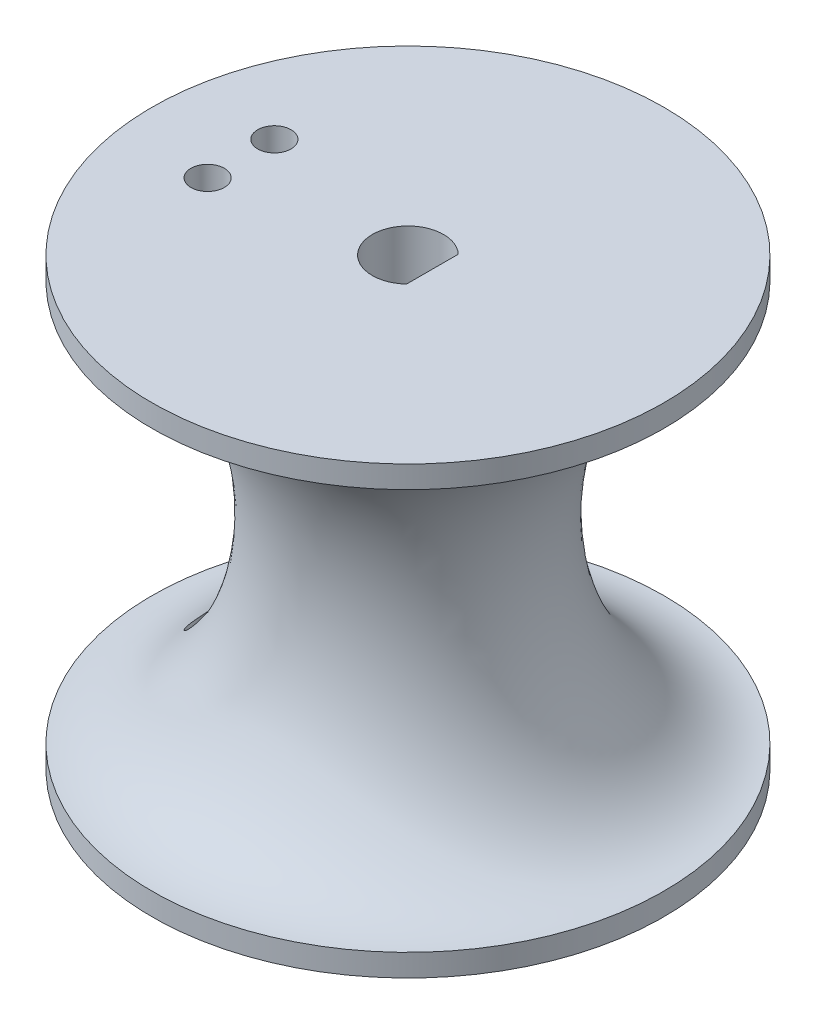
ISO-10303-21;
HEADER;
FILE_DESCRIPTION(('STEP AP214'),'2;1');
FILE_NAME('part.step','',(''),(''),'','','');
FILE_SCHEMA(('AUTOMOTIVE_DESIGN { 1 0 10303 214 1 1 1 1 }'));
ENDSEC;
DATA;
#1=APPLICATION_CONTEXT('core data for automotive mechanical design processes');
#2=APPLICATION_PROTOCOL_DEFINITION('international standard','automotive_design',2000,#1);
#3=PRODUCT_CONTEXT('',#1,'mechanical');
#4=PRODUCT('Part','Part','',(#3));
#5=PRODUCT_RELATED_PRODUCT_CATEGORY('part','',(#4));
#6=PRODUCT_DEFINITION_FORMATION('','',#4);
#7=PRODUCT_DEFINITION_CONTEXT('part definition',#1,'design');
#8=PRODUCT_DEFINITION('design','',#6,#7);
#9=PRODUCT_DEFINITION_SHAPE('','',#8);
#10=(LENGTH_UNIT() NAMED_UNIT(*) SI_UNIT(.MILLI.,.METRE.));
#11=(NAMED_UNIT(*) PLANE_ANGLE_UNIT() SI_UNIT($,.RADIAN.));
#12=(NAMED_UNIT(*) SI_UNIT($,.STERADIAN.) SOLID_ANGLE_UNIT());
#13=UNCERTAINTY_MEASURE_WITH_UNIT(LENGTH_MEASURE(1.E-05),#10,'distance_accuracy_value','');
#14=(GEOMETRIC_REPRESENTATION_CONTEXT(3) GLOBAL_UNCERTAINTY_ASSIGNED_CONTEXT((#13)) GLOBAL_UNIT_ASSIGNED_CONTEXT((#10,
#11,#12)) REPRESENTATION_CONTEXT('',''));
#15=CARTESIAN_POINT('',(0.,0.,0.));
#16=DIRECTION('',(0.,0.,1.));
#17=DIRECTION('',(1.,0.,0.));
#18=AXIS2_PLACEMENT_3D('',#15,#16,#17);
#19=CARTESIAN_POINT('',(0.,-1.5,0.));
#20=DIRECTION('',(0.,-1.,0.));
#21=DIRECTION('',(0.,0.,-1.));
#22=AXIS2_PLACEMENT_3D('',#19,#20,#21);
#23=CYLINDRICAL_SURFACE('',#22,23.);
#24=CARTESIAN_POINT('',(0.,40.,0.));
#25=DIRECTION('',(0.,-1.,0.));
#26=DIRECTION('',(0.,0.,-1.));
#27=AXIS2_PLACEMENT_3D('',#24,#25,#26);
#28=CIRCLE('',#27,23.);
#29=CARTESIAN_POINT('',(0.,40.,-23.));
#30=VERTEX_POINT('',#29);
#31=EDGE_CURVE('E11',#30,#30,#28,.T.);
#32=ORIENTED_EDGE('',*,*,#31,.T.);
#33=EDGE_LOOP('',(#32));
#34=FACE_BOUND('',#33,.T.);
#35=CARTESIAN_POINT('',(0.,38.,0.));
#36=DIRECTION('',(0.,-1.,0.));
#37=DIRECTION('',(0.,0.,-1.));
#38=AXIS2_PLACEMENT_3D('',#35,#36,#37);
#39=CIRCLE('',#38,23.);
#40=CARTESIAN_POINT('',(0.,38.,-23.));
#41=VERTEX_POINT('',#40);
#42=EDGE_CURVE('E39',#41,#41,#39,.T.);
#43=ORIENTED_EDGE('',*,*,#42,.F.);
#44=EDGE_LOOP('',(#43));
#45=FACE_BOUND('',#44,.T.);
#46=ADVANCED_FACE('F35',(#34,#45),#23,.T.);
#47=CARTESIAN_POINT('',(-23.,40.,0.));
#48=DIRECTION('',(0.,-1.,0.));
#49=DIRECTION('',(0.,0.,-1.));
#50=AXIS2_PLACEMENT_3D('',#47,#48,#49);
#51=PLANE('',#50);
#52=DIRECTION('',(0.,0.,1.));
#53=VECTOR('',#52,1.);
#54=CARTESIAN_POINT('',(2.2,40.,-2.32379000772445));
#55=LINE('',#54,#53);
#56=CARTESIAN_POINT('',(2.2,40.,-2.32379000772445));
#57=VERTEX_POINT('',#56);
#58=CARTESIAN_POINT('',(2.2,40.,2.32379000772445));
#59=VERTEX_POINT('',#58);
#60=EDGE_CURVE('E84',#57,#59,#55,.T.);
#61=ORIENTED_EDGE('',*,*,#60,.T.);
#62=CARTESIAN_POINT('',(0.,40.,0.));
#63=DIRECTION('',(0.,-1.,0.));
#64=DIRECTION('',(0.,0.,-1.));
#65=AXIS2_PLACEMENT_3D('',#62,#63,#64);
#66=CIRCLE('',#65,3.2);
#67=EDGE_CURVE('E52',#59,#57,#66,.T.);
#68=ORIENTED_EDGE('',*,*,#67,.T.);
#69=EDGE_LOOP('',(#61,#68));
#70=FACE_BOUND('',#69,.T.);
#71=CARTESIAN_POINT('',(-15.,40.,-3.));
#72=DIRECTION('',(0.,-1.,0.));
#73=DIRECTION('',(0.,0.,-1.));
#74=AXIS2_PLACEMENT_3D('',#71,#72,#73);
#75=CIRCLE('',#74,1.5);
#76=CARTESIAN_POINT('',(-15.,40.,-4.5));
#77=VERTEX_POINT('',#76);
#78=EDGE_CURVE('E78',#77,#77,#75,.T.);
#79=ORIENTED_EDGE('',*,*,#78,.T.);
#80=EDGE_LOOP('',(#79));
#81=FACE_BOUND('',#80,.T.);
#82=CARTESIAN_POINT('',(-15.,40.,3.));
#83=DIRECTION('',(0.,-1.,0.));
#84=DIRECTION('',(0.,0.,1.));
#85=AXIS2_PLACEMENT_3D('',#82,#83,#84);
#86=CIRCLE('',#85,1.5);
#87=CARTESIAN_POINT('',(-15.,40.,4.5));
#88=VERTEX_POINT('',#87);
#89=EDGE_CURVE('E90',#88,#88,#86,.T.);
#90=ORIENTED_EDGE('',*,*,#89,.T.);
#91=EDGE_LOOP('',(#90));
#92=FACE_BOUND('',#91,.T.);
#93=ORIENTED_EDGE('',*,*,#31,.F.);
#94=EDGE_LOOP('',(#93));
#95=FACE_BOUND('',#94,.T.);
#96=ADVANCED_FACE('F37',(#70,#81,#92,#95),#51,.F.);
#97=CARTESIAN_POINT('',(-23.,20.,0.));
#98=DIRECTION('',(0.,0.,1.));
#99=DIRECTION('',(0.,1.,0.));
#100=AXIS2_PLACEMENT_3D('',#97,#98,#99);
#101=ELLIPSE('',#100,18.,12.);
#102=CARTESIAN_POINT('',(0.,-1.5,0.));
#103=DIRECTION('',(0.,-1.,0.));
#104=AXIS1_PLACEMENT('',#102,#103);
#105=SURFACE_OF_REVOLUTION('',#101,#104);
#106=CARTESIAN_POINT('',(-15.,34.2406139442218,-4.5));
#107=CARTESIAN_POINT('',(-14.9350100897397,34.1684277342046,-4.5000012322229));
#108=CARTESIAN_POINT('',(-14.871434571679,34.094971794309,-4.49578508029407));
#109=CARTESIAN_POINT('',(-14.7474744455794,33.9461437740975,-4.47991142042085));
#110=CARTESIAN_POINT('',(-14.6870921871256,33.8707703416695,-4.46824851346216));
#111=CARTESIAN_POINT('',(-14.569517977669,33.718340252366,-4.43818772876105));
#112=CARTESIAN_POINT('',(-14.5123418573675,33.6412774800004,-4.41975933363757));
#113=CARTESIAN_POINT('',(-14.4016312249574,33.4862966933333,-4.37676449680087));
#114=CARTESIAN_POINT('',(-14.3480958639161,33.4083788833601,-4.35219949227571));
#115=CARTESIAN_POINT('',(-14.2423351095714,33.2484606175508,-4.29603061594189));
#116=CARTESIAN_POINT('',(-14.1902874387952,33.1664393272209,-4.26415175883944));
#117=CARTESIAN_POINT('',(-14.0903884054189,33.0024416542551,-4.19428767489236));
#118=CARTESIAN_POINT('',(-14.0425370383143,32.920465271571,-4.15630245460265));
#119=CARTESIAN_POINT('',(-13.9513809431258,32.7574699270498,-4.07431068462483));
#120=CARTESIAN_POINT('',(-13.9080598617781,32.6764485296206,-4.03032721336925));
#121=CARTESIAN_POINT('',(-13.8260945887054,32.5158883585745,-3.93587316800596));
#122=CARTESIAN_POINT('',(-13.7874469086239,32.4363485170718,-3.88540749115208));
#123=CARTESIAN_POINT('',(-13.7232179811447,32.2969344801562,-3.78893187165097));
#124=CARTESIAN_POINT('',(-13.6966234283623,32.2365472006551,-3.74434186156628));
#125=CARTESIAN_POINT('',(-13.6470734673021,32.1182125914091,-3.64995144616536));
#126=CARTESIAN_POINT('',(-13.6241224898726,32.060268294419,-3.60014481733635));
#127=CARTESIAN_POINT('',(-13.5825218563416,31.9479162680066,-3.49400534340336));
#128=CARTESIAN_POINT('',(-13.5639101585352,31.8935425343061,-3.43762094037126));
#129=CARTESIAN_POINT('',(-13.5326719466759,31.7915953502388,-3.31747148603314));
#130=CARTESIAN_POINT('',(-13.5200280235999,31.7440024063018,-3.25372858635741));
#131=CARTESIAN_POINT('',(-13.5067862279881,31.6787179914835,-3.14760993035048));
#132=CARTESIAN_POINT('',(-13.5033389938334,31.6570464189172,-3.10806396594339));
#133=CARTESIAN_POINT('',(-13.4996774171456,31.618720414169,-3.02643276357983));
#134=CARTESIAN_POINT('',(-13.4994606864801,31.602062284753,-2.98434942447428));
#135=CARTESIAN_POINT('',(-13.5028589743482,31.5751008449584,-2.89769840010615));
#136=CARTESIAN_POINT('',(-13.5065209741273,31.5648778981368,-2.85310659302476));
#137=CARTESIAN_POINT('',(-13.5180952713408,31.5524747446701,-2.76336825867317));
#138=CARTESIAN_POINT('',(-13.5260014399742,31.5502829762126,-2.71822262279049));
#139=CARTESIAN_POINT('',(-13.5445445293213,31.5539783830266,-2.63499157802872));
#140=CARTESIAN_POINT('',(-13.5546964370878,31.5588579911863,-2.59674780477223));
#141=CARTESIAN_POINT('',(-13.5775797917092,31.5743738903976,-2.52225254860966));
#142=CARTESIAN_POINT('',(-13.5903135848215,31.5850154323364,-2.48600291622174));
#143=CARTESIAN_POINT('',(-13.6227264328768,31.6157844607113,-2.40357535972314));
#144=CARTESIAN_POINT('',(-13.6432580121201,31.6379456400951,-2.358502727509));
#145=CARTESIAN_POINT('',(-13.6868595127811,31.6886640627381,-2.27338628340653));
#146=CARTESIAN_POINT('',(-13.7099386202141,31.7172448645314,-2.23336186432555));
#147=CARTESIAN_POINT('',(-13.7542523760365,31.774264151253,-2.16360455874971));
#148=CARTESIAN_POINT('',(-13.7752585978401,31.8021045407078,-2.13322395816701));
#149=CARTESIAN_POINT('',(-13.8181564157474,31.8600944034168,-2.07558964578018));
#150=CARTESIAN_POINT('',(-13.8400465683254,31.8902401784785,-2.04833109419751));
#151=CARTESIAN_POINT('',(-13.884614063887,31.9523695353553,-1.9964628369381));
#152=CARTESIAN_POINT('',(-13.9072936260237,31.9843584973776,-1.97186155807506));
#153=CARTESIAN_POINT('',(-13.9532591882495,32.0496724405392,-1.92510117684684));
#154=CARTESIAN_POINT('',(-13.9765454624513,32.0829980293674,-1.90294320287881));
#155=CARTESIAN_POINT('',(-14.0456874567492,32.1823388961603,-1.8411042213606));
#156=CARTESIAN_POINT('',(-14.0922591039129,32.2497439189827,-1.80444335404944));
#157=CARTESIAN_POINT('',(-14.1870084407787,32.3868232445888,-1.73810271773203));
#158=CARTESIAN_POINT('',(-14.2351872157183,32.4564990800127,-1.70842777967573));
#159=CARTESIAN_POINT('',(-14.3330331267048,32.5972857166462,-1.65528562501119));
#160=CARTESIAN_POINT('',(-14.3827020036937,32.6683981619024,-1.63182601156539));
#161=CARTESIAN_POINT('',(-14.4833714607026,32.8113620501289,-1.59072720874401));
#162=CARTESIAN_POINT('',(-14.534372252209,32.8832136093471,-1.57308894984422));
#163=CARTESIAN_POINT('',(-14.6422955563917,33.0337196190835,-1.54209773804245));
#164=CARTESIAN_POINT('',(-14.6993356167997,33.1124000152954,-1.52927855183937));
#165=CARTESIAN_POINT('',(-14.8147593960751,33.2696017383435,-1.5103335777489));
#166=CARTESIAN_POINT('',(-14.8731433563076,33.3481230338059,-1.50420900194596));
#167=CARTESIAN_POINT('',(-14.9909873499765,33.5044557789747,-1.49886932064048));
#168=CARTESIAN_POINT('',(-15.0504459823968,33.582267978378,-1.49964578729878));
#169=CARTESIAN_POINT('',(-15.1701966678908,33.7367912895732,-1.50847907790304));
#170=CARTESIAN_POINT('',(-15.2304884929244,33.8135026913733,-1.5165339471835));
#171=CARTESIAN_POINT('',(-15.38555339654,34.0080459805364,-1.54719190785291));
#172=CARTESIAN_POINT('',(-15.4806806045322,34.1247837812152,-1.57542396257802));
#173=CARTESIAN_POINT('',(-15.669468392177,34.3519947921834,-1.65380767277555));
#174=CARTESIAN_POINT('',(-15.7631306664739,34.4624756994128,-1.70393170565313));
#175=CARTESIAN_POINT('',(-15.9200901248196,34.6453949886028,-1.81259346720601));
#176=CARTESIAN_POINT('',(-15.9847931583523,34.7200884672439,-1.86526769520322));
#177=CARTESIAN_POINT('',(-16.1081284695424,34.862351833323,-1.98538842467332));
#178=CARTESIAN_POINT('',(-16.166769235992,34.9299316842234,-2.05281384638244));
#179=CARTESIAN_POINT('',(-16.2616967745426,35.0409557356986,-2.18565146159392));
#180=CARTESIAN_POINT('',(-16.3000209037217,35.0863732093309,-2.24794761264547));
#181=CARTESIAN_POINT('',(-16.3684962369868,35.1700329931097,-2.38128022925625));
#182=CARTESIAN_POINT('',(-16.39865675717,35.2082834665708,-2.45230659631833));
#183=CARTESIAN_POINT('',(-16.4443441708204,35.2705416128435,-2.58982780566146));
#184=CARTESIAN_POINT('',(-16.4614467582947,35.2958514593066,-2.65520565182677));
#185=CARTESIAN_POINT('',(-16.4868002465257,35.3393507698362,-2.78996139578918));
#186=CARTESIAN_POINT('',(-16.4950545677665,35.3575429836456,-2.85933773694671));
#187=CARTESIAN_POINT('',(-16.5016714940446,35.3860611032112,-3.00054444205227));
#188=CARTESIAN_POINT('',(-16.4999851376093,35.3963477901916,-3.07238521720542));
#189=CARTESIAN_POINT('',(-16.4861432853246,35.4083724994143,-3.21577627530713));
#190=CARTESIAN_POINT('',(-16.4739912870685,35.4101133763445,-3.28732664728233));
#191=CARTESIAN_POINT('',(-16.4410822331219,35.4051915987426,-3.42146445619727));
#192=CARTESIAN_POINT('',(-16.4211696146508,35.3992497591532,-3.48428885298939));
#193=CARTESIAN_POINT('',(-16.3737414804144,35.3804483070847,-3.60588176241475));
#194=CARTESIAN_POINT('',(-16.3462262740761,35.3675889761289,-3.66465043999507));
#195=CARTESIAN_POINT('',(-16.2844468201841,35.3352994560021,-3.77741739011953));
#196=CARTESIAN_POINT('',(-16.2501122027416,35.3157990961598,-3.83135660969012));
#197=CARTESIAN_POINT('',(-16.1762957471743,35.2709716591804,-3.93288386788125));
#198=CARTESIAN_POINT('',(-16.136812659735,35.2456431666594,-3.98047035927468));
#199=CARTESIAN_POINT('',(-16.0492554397883,35.186668932733,-4.07407497943163));
#200=CARTESIAN_POINT('',(-16.0007165737212,35.1523970374733,-4.11925948533753));
#201=CARTESIAN_POINT('',(-15.9006318776524,35.0785431104962,-4.20127366195799));
#202=CARTESIAN_POINT('',(-15.8490817948863,35.0389534607374,-4.23809113879433));
#203=CARTESIAN_POINT('',(-15.7562109208945,34.9648266733422,-4.29631737949796));
#204=CARTESIAN_POINT('',(-15.7151904128255,34.9311492175385,-4.31932990875198));
#205=CARTESIAN_POINT('',(-15.6327851703762,34.8615991510164,-4.36077490792615));
#206=CARTESIAN_POINT('',(-15.5914007365902,34.8257282285359,-4.37921084634654));
#207=CARTESIAN_POINT('',(-15.4671678632144,34.7151630396283,-4.42817611497831));
#208=CARTESIAN_POINT('',(-15.3843118285803,34.637573723557,-4.45231973943628));
#209=CARTESIAN_POINT('',(-15.251028716207,34.5064159248377,-4.4797897014654));
#210=CARTESIAN_POINT('',(-15.1998189728623,34.4544345836847,-4.48749955759076));
#211=CARTESIAN_POINT('',(-15.0988060133021,34.348745786009,-4.49760062993817));
#212=CARTESIAN_POINT('',(-15.0490009775684,34.2950407751503,-4.49999907093076));
#213=CARTESIAN_POINT('',(-15.,34.2406139442218,-4.5));
#214=B_SPLINE_CURVE_WITH_KNOTS('',3,(#106,#107,#108,#109,#110,#111,#112,#113,#114,#115,#116,
#117,#118,#119,#120,#121,#122,#123,#124,#125,#126,#127,#128,#129,#130,#131,#132,#133,#134,#135,
#136,#137,#138,#139,#140,#141,#142,#143,#144,#145,#146,#147,#148,#149,#150,#151,#152,#153,#154,
#155,#156,#157,#158,#159,#160,#161,#162,#163,#164,#165,#166,#167,#168,#169,#170,#171,#172,#173,
#174,#175,#176,#177,#178,#179,#180,#181,#182,#183,#184,#185,#186,#187,#188,#189,#190,#191,#192,
#193,#194,#195,#196,#197,#198,#199,#200,#201,#202,#203,#204,#205,#206,#207,#208,#209,#210,#211,
#212,#213),.UNSPECIFIED.,.T.,.F.,(4,2,2,2,2,2,2,2,2,2,2,2,2,2,2,2,2,2,2,2,2,2,2,2,2,2,2,2,2,2,2,
2,2,2,2,2,2,2,2,2,2,2,2,2,2,2,2,2,2,2,2,2,2,4),(0.,0.291306442662013,0.582824327259284,
0.875673663246119,1.16845447839207,1.47489851801443,1.78134222868475,2.08663851126706,
2.39170548685757,2.63039053960422,2.86936366306828,3.11035475238974,3.35063841662319,
3.48595790075455,3.62117734571415,3.75805357403736,3.89473267557063,4.01374639695004,
4.13286875928803,4.29473872763595,4.45721271886433,4.59577524765942,4.73411998425114,
4.87289130309558,5.01172644494157,5.28056450348733,5.54958792792815,5.81893894297376,
6.08833298981838,6.38216066224557,6.67604152447355,6.9695635365715,7.26300674471766,
7.72120199357665,8.17882076909496,8.51368721623705,8.84807822207352,9.10541784891248,
9.36246255636416,9.57804610544692,9.79354628607125,10.0101087678722,10.2265989030637,
10.4241773045357,10.6217476657055,10.8214739350523,11.0212487599644,11.244376991748,
11.4678283484017,11.6411387234053,11.8143173464054,12.1609758447391,12.3809139126456,
12.6005526289515),.UNSPECIFIED.);
#215=CARTESIAN_POINT('',(-15.,34.2406139442218,-4.5));
#216=VERTEX_POINT('',#215);
#217=EDGE_CURVE('E133',#216,#216,#214,.T.);
#218=ORIENTED_EDGE('',*,*,#217,.F.);
#219=EDGE_LOOP('',(#218));
#220=FACE_BOUND('',#219,.T.);
#221=CARTESIAN_POINT('',(-15.,5.75938605577824,-4.5));
#222=CARTESIAN_POINT('',(-15.0847339145067,5.66527186816123,-4.50000234360664));
#223=CARTESIAN_POINT('',(-15.1719209077483,5.57326443984956,-4.49284659967696));
#224=CARTESIAN_POINT('',(-15.3496287786371,5.39542564835471,-4.46146989123623));
#225=CARTESIAN_POINT('',(-15.4401483801787,5.30959195758755,-4.43725539567112));
#226=CARTESIAN_POINT('',(-15.6005535202079,5.16570084478835,-4.37654217901424));
#227=CARTESIAN_POINT('',(-15.6703436711977,5.10582509369986,-4.3442081087544));
#228=CARTESIAN_POINT('',(-15.7735357015416,5.02122565540318,-4.28576917946393));
#229=CARTESIAN_POINT('',(-15.8076652129111,4.99390891512623,-4.26464804794461));
#230=CARTESIAN_POINT('',(-15.8751506895989,4.9411902796168,-4.21892410608714));
#231=CARTESIAN_POINT('',(-15.9085056455036,4.91579079557056,-4.19431701997927));
#232=CARTESIAN_POINT('',(-15.9948622151934,4.85173549260089,-4.1247130274527));
#233=CARTESIAN_POINT('',(-16.0468693005553,4.81492084182204,-4.07670063675587));
#234=CARTESIAN_POINT('',(-16.1454551130474,4.74855337335497,-3.9711552342321));
#235=CARTESIAN_POINT('',(-16.1920418433816,4.71898977602103,-3.91363657045719));
#236=CARTESIAN_POINT('',(-16.2779096792503,4.66811675272171,-3.7891081168047));
#237=CARTESIAN_POINT('',(-16.3171231987395,4.6468819168616,-3.72201958407359));
#238=CARTESIAN_POINT('',(-16.3682089428492,4.62240665179734,-3.61607831842126));
#239=CARTESIAN_POINT('',(-16.3839507889058,4.61547708617357,-3.57987211314014));
#240=CARTESIAN_POINT('',(-16.4126396920364,4.60416075387769,-3.50598316357695));
#241=CARTESIAN_POINT('',(-16.425586879263,4.59977386877205,-3.46830048815352));
#242=CARTESIAN_POINT('',(-16.4567124192002,4.59141243800504,-3.36426394680241));
#243=CARTESIAN_POINT('',(-16.4719565054317,4.59000335930287,-3.29678032158883));
#244=CARTESIAN_POINT('',(-16.4929574611559,4.59503347997107,-3.16069663600636));
#245=CARTESIAN_POINT('',(-16.4987173897261,4.60147014756083,-3.09209694283328));
#246=CARTESIAN_POINT('',(-16.5008428269755,4.62134507369807,-2.95938463504236));
#247=CARTESIAN_POINT('',(-16.4976730605651,4.63440899531207,-2.89522177599968));
#248=CARTESIAN_POINT('',(-16.4835229034861,4.66679002246204,-2.7694118202554));
#249=CARTESIAN_POINT('',(-16.4725416537872,4.68610781561025,-2.70776500103168));
#250=CARTESIAN_POINT('',(-16.4426858804011,4.73186202509947,-2.58409196166531));
#251=CARTESIAN_POINT('',(-16.4233177298452,4.75869854250697,-2.52233468828286));
#252=CARTESIAN_POINT('',(-16.3780190877838,4.81786767186665,-2.40411417460727));
#253=CARTESIAN_POINT('',(-16.3520847435022,4.85020350692569,-2.34765406922741));
#254=CARTESIAN_POINT('',(-16.2818557811383,4.93543900633272,-2.21598662759106));
#255=CARTESIAN_POINT('',(-16.2345950844677,4.99096925525046,-2.14405365275859));
#256=CARTESIAN_POINT('',(-16.132522599091,5.10960542019726,-2.01291786479959));
#257=CARTESIAN_POINT('',(-16.0776952182708,5.17272694355732,-1.95374200164178));
#258=CARTESIAN_POINT('',(-15.9410163132408,5.33045412398603,-1.8268583769149));
#259=CARTESIAN_POINT('',(-15.8569749420454,5.42772616668202,-1.76484847055823));
#260=CARTESIAN_POINT('',(-15.6850976594923,5.62964570906173,-1.66182446710084));
#261=CARTESIAN_POINT('',(-15.5972562447539,5.734304054396,-1.62084200720489));
#262=CARTESIAN_POINT('',(-15.4458122873436,5.91824972453843,-1.5662036971677));
#263=CARTESIAN_POINT('',(-15.3823447908156,5.99638890581022,-1.54810336466427));
#264=CARTESIAN_POINT('',(-15.2557717977773,6.1545152154484,-1.52054759064312));
#265=CARTESIAN_POINT('',(-15.1926664816635,6.23450317922354,-1.51109613880992));
#266=CARTESIAN_POINT('',(-15.0672282582972,6.39586572566627,-1.50018260588977));
#267=CARTESIAN_POINT('',(-15.0048972411841,6.47724285712897,-1.49873726507087));
#268=CARTESIAN_POINT('',(-14.8814831840453,6.64068662836589,-1.50341507497414));
#269=CARTESIAN_POINT('',(-14.8203998953942,6.72275312608387,-1.5095367026296));
#270=CARTESIAN_POINT('',(-14.6977746451778,6.88968966475657,-1.52940806712871));
#271=CARTESIAN_POINT('',(-14.636279602311,6.97456605634147,-1.54339362593982));
#272=CARTESIAN_POINT('',(-14.5149814515832,7.14395150563199,-1.57916963212555));
#273=CARTESIAN_POINT('',(-14.4551791226742,7.22846037954689,-1.60096361173734));
#274=CARTESIAN_POINT('',(-14.3375016240168,7.39620366088124,-1.65269696645786));
#275=CARTESIAN_POINT('',(-14.2796246814199,7.47943920032904,-1.68262860174267));
#276=CARTESIAN_POINT('',(-14.165964487922,7.64354782996233,-1.75147838608104));
#277=CARTESIAN_POINT('',(-14.1101790516289,7.72442336531867,-1.7903868328838));
#278=CARTESIAN_POINT('',(-14.0283934420035,7.84248088664338,-1.85667057191302));
#279=CARTESIAN_POINT('',(-14.0014644085506,7.88126586224162,-1.88006700539194));
#280=CARTESIAN_POINT('',(-13.9483155071715,7.95738562109604,-1.929819389048));
#281=CARTESIAN_POINT('',(-13.9220953372097,7.9947210250466,-1.95617405329873));
#282=CARTESIAN_POINT('',(-13.8706077688782,8.06727682763083,-2.01211719634154));
#283=CARTESIAN_POINT('',(-13.8453368280222,8.10250545897708,-2.04169161231956));
#284=CARTESIAN_POINT('',(-13.7958909468703,8.17022511371182,-2.10461111182265));
#285=CARTESIAN_POINT('',(-13.7717148723915,8.20271900146815,-2.13795216220696));
#286=CARTESIAN_POINT('',(-13.7265703684328,8.26161040126388,-2.20632039282608));
#287=CARTESIAN_POINT('',(-13.7054970638258,8.28828145590832,-2.24103842270582));
#288=CARTESIAN_POINT('',(-13.6651078636742,8.33707156868051,-2.31456497258286));
#289=CARTESIAN_POINT('',(-13.6457925750962,8.35918905796138,-2.35337489542593));
#290=CARTESIAN_POINT('',(-13.6094513184061,8.39741154573477,-2.43571050332586));
#291=CARTESIAN_POINT('',(-13.5924609963544,8.41342848017468,-2.47929435809983));
#292=CARTESIAN_POINT('',(-13.5622023090794,8.43698367409999,-2.56988537275983));
#293=CARTESIAN_POINT('',(-13.5489241236103,8.44454446611688,-2.61688307794721));
#294=CARTESIAN_POINT('',(-13.5284575558661,8.44965349541764,-2.70610617887458));
#295=CARTESIAN_POINT('',(-13.5206931832042,8.4484025557659,-2.74813214467176));
#296=CARTESIAN_POINT('',(-13.5088463221748,8.43884520043941,-2.83191017257736));
#297=CARTESIAN_POINT('',(-13.5047673263584,8.43053210655726,-2.87366193772031));
#298=CARTESIAN_POINT('',(-13.4997117942735,8.40596310047698,-2.96232395460568));
#299=CARTESIAN_POINT('',(-13.4993505397864,8.3886319565895,-3.00896343449463));
#300=CARTESIAN_POINT('',(-13.5026042818345,8.34769637525646,-3.09931944016209));
#301=CARTESIAN_POINT('',(-13.5062320807581,8.32407192506843,-3.14302607440973));
#302=CARTESIAN_POINT('',(-13.5157083487553,8.277248233166,-3.21922509391792));
#303=CARTESIAN_POINT('',(-13.5210055448602,8.25481720325898,-3.25227279404319));
#304=CARTESIAN_POINT('',(-13.5333671432562,8.20773836957716,-3.31630415395772));
#305=CARTESIAN_POINT('',(-13.540428984498,8.18309381123825,-3.34729072327824));
#306=CARTESIAN_POINT('',(-13.5639061037997,8.10646153461083,-3.4376376762946));
#307=CARTESIAN_POINT('',(-13.5825887159074,8.05188663221323,-3.49421489640299));
#308=CARTESIAN_POINT('',(-13.6238005301869,7.94061728659225,-3.59928557037115));
#309=CARTESIAN_POINT('',(-13.6461776910841,7.88405760920249,-3.64798818729659));
#310=CARTESIAN_POINT('',(-13.6944782083624,7.7684531222551,-3.74049622104284));
#311=CARTESIAN_POINT('',(-13.7204041013519,7.70940655617856,-3.78429809377318));
#312=CARTESIAN_POINT('',(-13.7754044952107,7.58958484959329,-3.86767812426184));
#313=CARTESIAN_POINT('',(-13.8044869616806,7.52880563542755,-3.9072450714778));
#314=CARTESIAN_POINT('',(-13.8654716619821,7.40622547511702,-3.98243934284986));
#315=CARTESIAN_POINT('',(-13.8973746042934,7.34442427544556,-4.01806567206812));
#316=CARTESIAN_POINT('',(-13.9801336111183,7.18972783932721,-4.10221122484555));
#317=CARTESIAN_POINT('',(-14.032605717947,7.09646153036661,-4.14847426464989));
#318=CARTESIAN_POINT('',(-14.1430959140952,6.90956942165563,-4.23310828912512));
#319=CARTESIAN_POINT('',(-14.2011173002926,6.81594344032084,-4.27147453904299));
#320=CARTESIAN_POINT('',(-14.3223003986215,6.62946988687639,-4.33998190585107));
#321=CARTESIAN_POINT('',(-14.3854448756418,6.53662077646272,-4.37014922801641));
#322=CARTESIAN_POINT('',(-14.516828250467,6.35220567637362,-4.42180272614641));
#323=CARTESIAN_POINT('',(-14.5850628887921,6.26063868836271,-4.44329606611152));
#324=CARTESIAN_POINT('',(-14.710323759202,6.10015068342231,-4.47283063846429));
#325=CARTESIAN_POINT('',(-14.7663656083531,6.030819485966,-4.48282031473015));
#326=CARTESIAN_POINT('',(-14.8811940318363,5.89376813200396,-4.49640538893355));
#327=CARTESIAN_POINT('',(-14.9399816476626,5.82604860176393,-4.49999833998689));
#328=CARTESIAN_POINT('',(-15.,5.75938605577824,-4.5));
#329=B_SPLINE_CURVE_WITH_KNOTS('',3,(#221,#222,#223,#224,#225,#226,#227,#228,#229,#230,#231,
#232,#233,#234,#235,#236,#237,#238,#239,#240,#241,#242,#243,#244,#245,#246,#247,#248,#249,#250,
#251,#252,#253,#254,#255,#256,#257,#258,#259,#260,#261,#262,#263,#264,#265,#266,#267,#268,#269,
#270,#271,#272,#273,#274,#275,#276,#277,#278,#279,#280,#281,#282,#283,#284,#285,#286,#287,#288,
#289,#290,#291,#292,#293,#294,#295,#296,#297,#298,#299,#300,#301,#302,#303,#304,#305,#306,#307,
#308,#309,#310,#311,#312,#313,#314,#315,#316,#317,#318,#319,#320,#321,#322,#323,#324,#325,#326,
#327,#328),.UNSPECIFIED.,.T.,.F.,(4,2,2,2,2,2,2,2,2,2,2,2,2,2,2,2,2,2,2,2,2,2,2,2,2,2,2,2,2,2,2,
2,2,2,2,2,2,2,2,2,2,2,2,2,2,2,2,2,2,2,2,2,2,4),(0.,0.379724918673795,0.759305917166248,
1.05064040247848,1.19614241712588,1.34182447088102,1.58014660197493,1.8181122586383,
2.0581628993174,2.17823584506285,2.29830319757466,2.50471945488763,2.71106912040272,
2.90688110333992,3.10271462309139,3.31209974744848,3.5216080163846,3.82718087842126,
4.13339308467161,4.55922843244619,4.98570261302633,5.29216597774143,5.59877064128222,
5.90601615432996,6.21319983558546,6.53012813299862,6.84719997829408,7.16397130134618,
7.48040184467775,7.63840550679307,7.79634074965837,7.95361193789863,8.11071629546228,
8.256152248282,8.40163822483047,8.54915122201638,8.69627020742841,8.82376909921464,
8.95138869256404,9.09984499709724,9.24877914862725,9.36948278950674,9.49001225904293,
9.73167966515457,9.96514643564222,10.1987809665676,10.4330194188783,10.667316877993,
11.0166306697588,11.3661532966783,11.7145452844471,12.0626489371088,12.3315111920472,
12.6004762704689),.UNSPECIFIED.);
#330=CARTESIAN_POINT('',(-15.,5.75938605577824,-4.5));
#331=VERTEX_POINT('',#330);
#332=EDGE_CURVE('E128',#331,#331,#329,.T.);
#333=ORIENTED_EDGE('',*,*,#332,.F.);
#334=EDGE_LOOP('',(#333));
#335=FACE_BOUND('',#334,.T.);
#336=CARTESIAN_POINT('',(-15.,33.5159420751577,1.5));
#337=CARTESIAN_POINT('',(-14.9290786642955,33.4228388398862,1.49999815165017));
#338=CARTESIAN_POINT('',(-14.8588943162632,33.3291557346774,1.50501527741994));
#339=CARTESIAN_POINT('',(-14.7203344473975,33.1413439459763,1.52463935994781));
#340=CARTESIAN_POINT('',(-14.6519606631734,33.0472149300057,1.53925519977141));
#341=CARTESIAN_POINT('',(-14.5173526940402,32.8594617111412,1.57804472893083));
#342=CARTESIAN_POINT('',(-14.4511174702974,32.7658372821273,1.6022136997864));
#343=CARTESIAN_POINT('',(-14.3210093226354,32.5801855686254,1.66057469522882));
#344=CARTESIAN_POINT('',(-14.2571338978738,32.4881566515774,1.69475574493818));
#345=CARTESIAN_POINT('',(-14.1498133938812,32.3330464424388,1.76307281387563));
#346=CARTESIAN_POINT('',(-14.1057342340927,32.2691905476024,1.79444496246077));
#347=CARTESIAN_POINT('',(-14.0190636674538,32.1440262795371,1.86384260888052));
#348=CARTESIAN_POINT('',(-13.9764732208795,32.0827195459514,1.90187230942765));
#349=CARTESIAN_POINT('',(-13.8927714833472,31.9636674027976,1.98628434009728));
#350=CARTESIAN_POINT('',(-13.851677959116,31.9059610921522,2.03274215719445));
#351=CARTESIAN_POINT('',(-13.7922543151357,31.8249414318272,2.10983544428449));
#352=CARTESIAN_POINT('',(-13.7728325237841,31.7988793597359,2.13673982506167));
#353=CARTESIAN_POINT('',(-13.7349319419736,31.749193316989,2.19330148094612));
#354=CARTESIAN_POINT('',(-13.7164523471268,31.7255672483919,2.22295634474343));
#355=CARTESIAN_POINT('',(-13.6794789643571,31.6799813298388,2.28746907322858));
#356=CARTESIAN_POINT('',(-13.6610744447348,31.658253325644,2.32254572091919));
#357=CARTESIAN_POINT('',(-13.6262572718273,31.6197744895058,2.39627092411158));
#358=CARTESIAN_POINT('',(-13.6098431678609,31.6030200196312,2.43491684157808));
#359=CARTESIAN_POINT('',(-13.5795722392283,31.5758186576642,2.51598145568502));
#360=CARTESIAN_POINT('',(-13.5657491109487,31.5654513355138,2.55844048030049));
#361=CARTESIAN_POINT('',(-13.5417878981517,31.552719726977,2.6455332181862));
#362=CARTESIAN_POINT('',(-13.5316445056708,31.5503438717376,2.69016369285092));
#363=CARTESIAN_POINT('',(-13.5165691743497,31.5536878576844,2.77412275571738));
#364=CARTESIAN_POINT('',(-13.5111397091559,31.558419926365,2.8134064948021));
#365=CARTESIAN_POINT('',(-13.503443704296,31.5736810607674,2.89114840001551));
#366=CARTESIAN_POINT('',(-13.5011800622461,31.5842154249439,2.92960577814025));
#367=CARTESIAN_POINT('',(-13.4992466432853,31.6146747129212,3.01809472340186));
#368=CARTESIAN_POINT('',(-13.500765201752,31.6365974039942,3.06745450762983));
#369=CARTESIAN_POINT('',(-13.5080643609964,31.6868326875136,3.16254445593988));
#370=CARTESIAN_POINT('',(-13.5138607575656,31.7151686913638,3.20826047049279));
#371=CARTESIAN_POINT('',(-13.5277036197537,31.7716795101631,3.28943773468899));
#372=CARTESIAN_POINT('',(-13.5352858190466,31.7992485876359,3.32541173157905));
#373=CARTESIAN_POINT('',(-13.5524572976938,31.8566918717984,3.39483811959238));
#374=CARTESIAN_POINT('',(-13.5620434149048,31.8865624005028,3.42829437187694));
#375=CARTESIAN_POINT('',(-13.5829498709008,31.9481394437208,3.49308322294372));
#376=CARTESIAN_POINT('',(-13.5942754678217,31.9798513372715,3.52440895282425));
#377=CARTESIAN_POINT('',(-13.6184159830726,32.044611818235,3.58505535526394));
#378=CARTESIAN_POINT('',(-13.6312315813918,32.0776610114276,3.61437510258424));
#379=CARTESIAN_POINT('',(-13.6708072694389,32.1762212014894,3.69783058989117));
#380=CARTESIAN_POINT('',(-13.6993793695182,32.2431260696573,3.74947026566559));
#381=CARTESIAN_POINT('',(-13.7606612390697,32.3792172622227,3.84696522696345));
#382=CARTESIAN_POINT('',(-13.7933738610031,32.4484051348857,3.89281648085079));
#383=CARTESIAN_POINT('',(-13.8625287429566,32.5882280428065,3.97940343098625));
#384=CARTESIAN_POINT('',(-13.8989754528722,32.6588647225483,4.02013289185645));
#385=CARTESIAN_POINT('',(-13.9753044110534,32.8008927935666,4.09677851517798));
#386=CARTESIAN_POINT('',(-14.0151872161944,32.8722843055251,4.13269389500913));
#387=CARTESIAN_POINT('',(-14.1020454688833,33.0219346684678,4.20294549215892));
#388=CARTESIAN_POINT('',(-14.1493358920929,33.1002215896961,4.23683313507438));
#389=CARTESIAN_POINT('',(-14.2476991407896,33.2566620120279,4.29901057343464));
#390=CARTESIAN_POINT('',(-14.2987726372188,33.3348154869377,4.32729937262131));
#391=CARTESIAN_POINT('',(-14.4045424604643,33.4904485726389,4.3779932675788));
#392=CARTESIAN_POINT('',(-14.4592344759612,33.5679288652204,4.40040521274496));
#393=CARTESIAN_POINT('',(-14.5721616209786,33.7218289937213,4.43892683551469));
#394=CARTESIAN_POINT('',(-14.6303958433352,33.7982490950514,4.45503811893918));
#395=CARTESIAN_POINT('',(-14.7851670332823,33.9936190517601,4.48770143790159));
#396=CARTESIAN_POINT('',(-14.8842899247346,34.1114659124723,4.49906455720486));
#397=CARTESIAN_POINT('',(-15.0897928748372,34.340899581437,4.50082349808884));
#398=CARTESIAN_POINT('',(-15.1961636228832,34.4524940975746,4.49124574610233));
#399=CARTESIAN_POINT('',(-15.383830965782,34.6370496282808,4.45230854275898));
#400=CARTESIAN_POINT('',(-15.4641202414001,34.7122911169419,4.42900599780929));
#401=CARTESIAN_POINT('',(-15.624869087811,34.8556633497798,4.36636558682859));
#402=CARTESIAN_POINT('',(-15.7053282535081,34.9238040633957,4.32705059373618));
#403=CARTESIAN_POINT('',(-15.8447985725828,35.0357963956163,4.24152141543489));
#404=CARTESIAN_POINT('',(-15.9044736142364,35.0816240086171,4.19899439875964));
#405=CARTESIAN_POINT('',(-16.0196948954278,35.1661021842361,4.10265187868205));
#406=CARTESIAN_POINT('',(-16.075245812032,35.2047609537881,4.0488494357157));
#407=CARTESIAN_POINT('',(-16.1709976463551,35.2677080575763,3.93975675977455));
#408=CARTESIAN_POINT('',(-16.2122256605115,35.2933110113885,3.88613172199772));
#409=CARTESIAN_POINT('',(-16.2880810874956,35.3373957538564,3.77171814225833));
#410=CARTESIAN_POINT('',(-16.3227110531024,35.3558802994561,3.71093238556232));
#411=CARTESIAN_POINT('',(-16.3838011271974,35.3849721754366,3.58320513208669));
#412=CARTESIAN_POINT('',(-16.4102194023344,35.3955395456228,3.51623429918897));
#413=CARTESIAN_POINT('',(-16.4532650268023,35.4080948458421,3.37844828607973));
#414=CARTESIAN_POINT('',(-16.4698957395399,35.4100857245965,3.30763443563351));
#415=CARTESIAN_POINT('',(-16.4916815844681,35.4056030046565,3.17100915016976));
#416=CARTESIAN_POINT('',(-16.4977244822687,35.3998652332039,3.10531178754796));
#417=CARTESIAN_POINT('',(-16.5012087165207,35.3814496467041,2.97468614512422));
#418=CARTESIAN_POINT('',(-16.4986505864767,35.368772262148,2.90975781787125));
#419=CARTESIAN_POINT('',(-16.4854492025706,35.3368491040895,2.7817801051666));
#420=CARTESIAN_POINT('',(-16.4747320347511,35.3175441735664,2.71875340496449));
#421=CARTESIAN_POINT('',(-16.4460855609052,35.2730957208879,2.59653893798908));
#422=CARTESIAN_POINT('',(-16.4281540439504,35.2479504098735,2.5373523545312));
#423=CARTESIAN_POINT('',(-16.3837867865992,35.1893883827028,2.41716312572948));
#424=CARTESIAN_POINT('',(-16.3566080518613,35.155351782365,2.3567402006013));
#425=CARTESIAN_POINT('',(-16.296242458513,35.0819620968218,2.24240856141521));
#426=CARTESIAN_POINT('',(-16.2630468763464,35.0426013136275,2.18850949777008));
#427=CARTESIAN_POINT('',(-16.2001644615375,34.9689485300174,2.09895322639728));
#428=CARTESIAN_POINT('',(-16.1713823671182,34.9355238308915,2.06192749009502));
#429=CARTESIAN_POINT('',(-16.1117167807765,34.8664851572791,1.99193318227221));
#430=CARTESIAN_POINT('',(-16.0808350596952,34.8308730300755,1.95896125607147));
#431=CARTESIAN_POINT('',(-15.9855823309225,34.7209924480172,1.86574384915934));
#432=CARTESIAN_POINT('',(-15.9187300336037,34.6438252459365,1.81136926349146));
#433=CARTESIAN_POINT('',(-15.8013987366832,34.5070614370183,1.73063893082784));
#434=CARTESIAN_POINT('',(-15.7517293559165,34.4487809249801,1.70072087681251));
#435=CARTESIAN_POINT('',(-15.6514173146595,34.3299932542588,1.64764200292759));
#436=CARTESIAN_POINT('',(-15.6007742567225,34.2694851766701,1.62448400767221));
#437=CARTESIAN_POINT('',(-15.4484192977713,34.0854646849907,1.56443358696347));
#438=CARTESIAN_POINT('',(-15.3461327794487,33.9592840963327,1.53686807678166));
#439=CARTESIAN_POINT('',(-15.2036491306863,33.7792535236867,1.51330529684458));
#440=CARTESIAN_POINT('',(-15.1626507800071,33.7269465217878,1.50828238920681));
#441=CARTESIAN_POINT('',(-15.0810219050814,33.6218031114268,1.50163004977443));
#442=CARTESIAN_POINT('',(-15.0403914286166,33.5689666360192,1.50000105268027));
#443=CARTESIAN_POINT('',(-15.,33.5159420751577,1.5));
#444=B_SPLINE_CURVE_WITH_KNOTS('',3,(#336,#337,#338,#339,#340,#341,#342,#343,#344,#345,#346,
#347,#348,#349,#350,#351,#352,#353,#354,#355,#356,#357,#358,#359,#360,#361,#362,#363,#364,#365,
#366,#367,#368,#369,#370,#371,#372,#373,#374,#375,#376,#377,#378,#379,#380,#381,#382,#383,#384,
#385,#386,#387,#388,#389,#390,#391,#392,#393,#394,#395,#396,#397,#398,#399,#400,#401,#402,#403,
#404,#405,#406,#407,#408,#409,#410,#411,#412,#413,#414,#415,#416,#417,#418,#419,#420,#421,#422,
#423,#424,#425,#426,#427,#428,#429,#430,#431,#432,#433,#434,#435,#436,#437,#438,#439,#440,#441,
#442,#443),.UNSPECIFIED.,.T.,.F.,(4,2,2,2,2,2,2,2,2,2,2,2,2,2,2,2,2,2,2,2,2,2,2,2,2,2,2,2,2,2,2,
2,2,2,2,2,2,2,2,2,2,2,2,2,2,2,2,2,2,2,2,2,2,4),(0.,0.351044211499309,0.70241375317303,
1.05360996291531,1.40442263564712,1.6552474060355,1.90623108931835,2.15958494997598,
2.28603222110302,2.41236966701734,2.54753657155844,2.6826043621796,2.81932246852601,
2.95584256942758,3.07506216470752,3.19439080810631,3.35557543827004,3.51735823466017,
3.65502237008092,3.79247089216569,3.9303433851296,4.0682790475301,4.33549164210091,
4.60288933531723,4.8706094757532,5.13837308652479,5.43074816873275,5.7231752294755,
6.0152599400957,6.30727015982693,6.76904135250518,7.23023014719552,7.5665722316805,
7.9024355449082,8.16077384468083,8.41881454641172,8.63488681257295,8.85087531004953,
9.06794675060968,9.28494355292227,9.48267423359172,9.68039264964938,9.8799238602789,
10.0795162664075,10.3021601062534,10.525129367724,10.6976645786221,10.8700560351431,
11.2156051504237,11.4619471501627,11.7083919342709,12.200548901946,12.4004515308134,
12.6003797621303),.UNSPECIFIED.);
#445=CARTESIAN_POINT('',(-15.,33.5159420751577,1.5));
#446=VERTEX_POINT('',#445);
#447=EDGE_CURVE('E103',#446,#446,#444,.T.);
#448=ORIENTED_EDGE('',*,*,#447,.F.);
#449=EDGE_LOOP('',(#448));
#450=FACE_BOUND('',#449,.T.);
#451=CARTESIAN_POINT('',(-15.,6.48405792484229,1.5));
#452=CARTESIAN_POINT('',(-15.0625416539578,6.4019554720078,1.50000068954935));
#453=CARTESIAN_POINT('',(-15.1256640073024,6.32029391060032,1.50390260315032));
#454=CARTESIAN_POINT('',(-15.2527061943146,6.15836935210111,1.52005371590131));
#455=CARTESIAN_POINT('',(-15.316626224195,6.07810671123515,1.53230501021406));
#456=CARTESIAN_POINT('',(-15.4444219831195,5.91993502627594,1.56583253774128));
#457=CARTESIAN_POINT('',(-15.5082969489198,5.8420181637402,1.58707412253307));
#458=CARTESIAN_POINT('',(-15.6353318188972,5.68905272668182,1.63945995083807));
#459=CARTESIAN_POINT('',(-15.6984922921936,5.61400173669506,1.67059563922034));
#460=CARTESIAN_POINT('',(-15.829334700562,5.46011190308803,1.74758315714391));
#461=CARTESIAN_POINT('',(-15.896811674813,5.38167995404217,1.79462101887534));
#462=CARTESIAN_POINT('',(-16.0269514550376,5.2311881652146,1.90339387093567));
#463=CARTESIAN_POINT('',(-16.0896188122765,5.15912229131396,1.96511473439483));
#464=CARTESIAN_POINT('',(-16.1954471901516,5.03659623676944,2.09097881256341));
#465=CARTESIAN_POINT('',(-16.2400513012536,4.98463365480753,2.15242873116338));
#466=CARTESIAN_POINT('',(-16.3212424086382,4.88805812178256,2.2855934902675));
#467=CARTESIAN_POINT('',(-16.3578395878545,4.84343585370954,2.35729509876484));
#468=CARTESIAN_POINT('',(-16.414208177047,4.77100500416875,2.49553675073845));
#469=CARTESIAN_POINT('',(-16.4358542151978,4.74161263848354,2.56047741082749));
#470=CARTESIAN_POINT('',(-16.4703873072444,4.6899413126184,2.69537191845995));
#471=CARTESIAN_POINT('',(-16.4832779304852,4.66765945564351,2.76532371022829));
#472=CARTESIAN_POINT('',(-16.4989800621525,4.63108723551465,2.90888891505749));
#473=CARTESIAN_POINT('',(-16.5017296041179,4.61684645297174,2.98252206225439));
#474=CARTESIAN_POINT('',(-16.4961384527958,4.59732500907944,3.13055809887323));
#475=CARTESIAN_POINT('',(-16.4878033565721,4.59203982876285,3.20496058101051));
#476=CARTESIAN_POINT('',(-16.4615551077558,4.59078116385161,3.34398813775121));
#477=CARTESIAN_POINT('',(-16.4447444373828,4.59388468070674,3.40881701480388));
#478=CARTESIAN_POINT('',(-16.4029331653797,4.6073349402783,3.5349691215985));
#479=CARTESIAN_POINT('',(-16.3779337345393,4.6176806477814,3.59629285101837));
#480=CARTESIAN_POINT('',(-16.3212242305153,4.64498726946807,3.71311422178552));
#481=CARTESIAN_POINT('',(-16.2896052128673,4.66186081890852,3.76867700393507));
#482=CARTESIAN_POINT('',(-16.2207865433655,4.70159059849635,3.8738616506585));
#483=CARTESIAN_POINT('',(-16.1835856466272,4.72444816406292,3.92348218552755));
#484=CARTESIAN_POINT('',(-16.1011212217782,4.77791475239273,4.02077867316584));
#485=CARTESIAN_POINT('',(-16.0554248106562,4.8090639896619,4.06778715954726));
#486=CARTESIAN_POINT('',(-15.9605865790058,4.87675500949688,4.15385594762536));
#487=CARTESIAN_POINT('',(-15.9114399833082,4.9133043464052,4.19290492945333));
#488=CARTESIAN_POINT('',(-15.8233720398074,4.98142315575412,4.25467488339249));
#489=CARTESIAN_POINT('',(-15.7848642538791,5.01204805301645,4.27905848571066));
#490=CARTESIAN_POINT('',(-15.7072566099203,5.07547117501549,4.32355084524197));
#491=CARTESIAN_POINT('',(-15.6681572854387,5.10826752195354,4.3436632343277));
#492=CARTESIAN_POINT('',(-15.5503863513251,5.20963352811032,4.39805719234482));
#493=CARTESIAN_POINT('',(-15.4713722518381,5.28107940018476,4.42630761328861));
#494=CARTESIAN_POINT('',(-15.2826961191934,5.46014089097966,4.47757207905529));
#495=CARTESIAN_POINT('',(-15.1738332857572,5.57052172475626,4.49362183613583));
#496=CARTESIAN_POINT('',(-14.9628826895037,5.7984634395338,4.50326134329581));
#497=CARTESIAN_POINT('',(-14.8608063731554,5.91603583960549,4.49681408148083));
#498=CARTESIAN_POINT('',(-14.6940416615778,6.12017157701946,4.47012082576139));
#499=CARTESIAN_POINT('',(-14.627204724742,6.20565470731824,4.4545047600813));
#500=CARTESIAN_POINT('',(-14.49795906838,6.3781345278685,4.41510525063748));
#501=CARTESIAN_POINT('',(-14.4355523653395,6.46513188519298,4.39131811609061));
#502=CARTESIAN_POINT('',(-14.315260511056,6.64011282117979,4.33623235059852));
#503=CARTESIAN_POINT('',(-14.2573843495651,6.72809798338141,4.30491926324815));
#504=CARTESIAN_POINT('',(-14.1464279081654,6.90424942812336,4.23519583072919));
#505=CARTESIAN_POINT('',(-14.0933463531056,6.99241565609075,4.19678738093422));
#506=CARTESIAN_POINT('',(-14.0029868543647,7.1494186606442,4.12188714503528));
#507=CARTESIAN_POINT('',(-13.9647575960219,7.21835498391038,4.08674359024312));
#508=CARTESIAN_POINT('',(-13.8915246203379,7.35548152467017,4.01194029868701));
#509=CARTESIAN_POINT('',(-13.8565202946814,7.42367188072732,3.97228141681249));
#510=CARTESIAN_POINT('',(-13.7901363988785,7.5584253882928,3.88830325827019));
#511=CARTESIAN_POINT('',(-13.7587403927278,7.62499473291714,3.84400702582924));
#512=CARTESIAN_POINT('',(-13.6997738408976,7.75605302821604,3.74999739760143));
#513=CARTESIAN_POINT('',(-13.6722042829946,7.82054143842371,3.70028260893552));
#514=CARTESIAN_POINT('',(-13.6267261224737,7.93338488985838,3.60523041840068));
#515=CARTESIAN_POINT('',(-13.6079911498412,7.98236618100254,3.56103941291922));
#516=CARTESIAN_POINT('',(-13.5740296474181,8.07697778077629,3.46803454774705));
#517=CARTESIAN_POINT('',(-13.5587978978707,8.12261300497207,3.41922772072894));
#518=CARTESIAN_POINT('',(-13.5325497605309,8.20945131309262,3.31544390014511));
#519=CARTESIAN_POINT('',(-13.5215960379421,8.2505825843331,3.2603894038333));
#520=CARTESIAN_POINT('',(-13.5057965821549,8.324429469624,3.14409251399799));
#521=CARTESIAN_POINT('',(-13.5009247603101,8.35718054644534,3.08287777610658));
#522=CARTESIAN_POINT('',(-13.4996440257549,8.39880185628349,2.98117737328011));
#523=CARTESIAN_POINT('',(-13.5005825517918,8.41195662745889,2.94249435492429));
#524=CARTESIAN_POINT('',(-13.505674834172,8.43258638728809,2.86384311623266));
#525=CARTESIAN_POINT('',(-13.5098245312902,8.44006852306904,2.82387657947717));
#526=CARTESIAN_POINT('',(-13.521533055359,8.44857125306173,2.74350089691772));
#527=CARTESIAN_POINT('',(-13.5291108169453,8.44955547930314,2.70309052581682));
#528=CARTESIAN_POINT('',(-13.5474699961174,8.44484006555357,2.62339610473977));
#529=CARTESIAN_POINT('',(-13.5582529350716,8.43913724769823,2.58411259937262));
#530=CARTESIAN_POINT('',(-13.5817295079439,8.42225938403915,2.51018044137222));
#531=CARTESIAN_POINT('',(-13.594263560772,8.41144490689922,2.47539540993809));
#532=CARTESIAN_POINT('',(-13.6211829054036,8.3854032171095,2.40824370504923));
#533=CARTESIAN_POINT('',(-13.6355712421334,8.37016869361927,2.3758811508961));
#534=CARTESIAN_POINT('',(-13.6637197395299,8.33848166632376,2.31790619233282));
#535=CARTESIAN_POINT('',(-13.67730861063,8.32246116727362,2.29196866633409));
#536=CARTESIAN_POINT('',(-13.705287979803,8.28833537834102,2.2420165339093));
#537=CARTESIAN_POINT('',(-13.7196779060764,8.27023156593839,2.21800058494953));
#538=CARTESIAN_POINT('',(-13.7639016447097,8.21330314184707,2.14847690883313));
#539=CARTESIAN_POINT('',(-13.7947100915471,8.17195371107062,2.10565105760142));
#540=CARTESIAN_POINT('',(-13.855671882051,8.08822645448146,2.02905825639105));
#541=CARTESIAN_POINT('',(-13.8857076191642,8.04614635079874,1.99485731900943));
#542=CARTESIAN_POINT('',(-13.9469093571474,7.95945607440364,1.93090768303804));
#543=CARTESIAN_POINT('',(-13.9780761941313,7.9148440157351,1.90116236491056));
#544=CARTESIAN_POINT('',(-14.0413709418218,7.82380579463178,1.84552665839823));
#545=CARTESIAN_POINT('',(-14.0735004905263,7.77737649373143,1.81964334750167));
#546=CARTESIAN_POINT('',(-14.1385612438362,7.68327647829679,1.77135753292556));
#547=CARTESIAN_POINT('',(-14.1714927102189,7.63560535802013,1.74895618400164));
#548=CARTESIAN_POINT('',(-14.2666229719447,7.49816300168711,1.68946958435615));
#549=CARTESIAN_POINT('',(-14.3297177732775,7.40732340809858,1.65625253990806));
#550=CARTESIAN_POINT('',(-14.4581688579835,7.22417516758965,1.59952058020189));
#551=CARTESIAN_POINT('',(-14.5235269469208,7.13186538105755,1.57601361397363));
#552=CARTESIAN_POINT('',(-14.6563869132759,6.94667738497517,1.53825273072614));
#553=CARTESIAN_POINT('',(-14.7238919167846,6.85379852195936,1.52401302153976));
#554=CARTESIAN_POINT('',(-14.8606891949094,6.66844831454196,1.50488833497314));
#555=CARTESIAN_POINT('',(-14.9299806668425,6.57597680824671,1.49999922800594));
#556=CARTESIAN_POINT('',(-15.,6.48405792484229,1.5));
#557=B_SPLINE_CURVE_WITH_KNOTS('',3,(#451,#452,#453,#454,#455,#456,#457,#458,#459,#460,#461,
#462,#463,#464,#465,#466,#467,#468,#469,#470,#471,#472,#473,#474,#475,#476,#477,#478,#479,#480,
#481,#482,#483,#484,#485,#486,#487,#488,#489,#490,#491,#492,#493,#494,#495,#496,#497,#498,#499,
#500,#501,#502,#503,#504,#505,#506,#507,#508,#509,#510,#511,#512,#513,#514,#515,#516,#517,#518,
#519,#520,#521,#522,#523,#524,#525,#526,#527,#528,#529,#530,#531,#532,#533,#534,#535,#536,#537,
#538,#539,#540,#541,#542,#543,#544,#545,#546,#547,#548,#549,#550,#551,#552,#553,#554,#555,#556),
.UNSPECIFIED.,.T.,.F.,(4,2,2,2,2,2,2,2,2,2,2,2,2,2,2,2,2,2,2,2,2,2,2,2,2,2,2,2,2,2,2,2,2,2,2,2,
2,2,2,2,2,2,2,2,2,2,2,2,2,2,2,2,4),(0.,0.309543896458623,0.619165497332121,0.927604534508566,
1.23577759620335,1.57571432158403,1.91532529905575,2.19034556664289,2.46501401339534,
2.68759939741956,2.9100939848708,3.13394588060594,3.3576847877427,3.55783452490342,
3.75795565809782,3.9554863037259,4.15306106878871,4.37000394546069,4.58725323431023,
4.75177080797988,4.91614792490614,5.2454555006551,5.7105712621649,6.17645258849657,
6.50494578972615,6.83358756330093,7.16286573372641,7.49205607142249,7.75081228218932,
8.00951958370898,8.26699738109402,8.52454152180764,8.73002788063884,8.93520605480493,
9.14328609127418,9.35047045537324,9.47262935766053,9.59463409124931,9.71732109506764,
9.84006642670864,9.95521408497072,10.0705532961265,10.170540799256,10.2704578235458,
10.4708824347184,10.656610980532,10.8424797318763,11.0286850284039,11.2149519467818,
11.5608469574695,11.9070245721188,12.2537316766628,12.6002856265733),.UNSPECIFIED.);
#558=CARTESIAN_POINT('',(-15.,6.48405792484229,1.5));
#559=VERTEX_POINT('',#558);
#560=EDGE_CURVE('E68',#559,#559,#557,.T.);
#561=ORIENTED_EDGE('',*,*,#560,.F.);
#562=EDGE_LOOP('',(#561));
#563=FACE_BOUND('',#562,.T.);
#564=CARTESIAN_POINT('',(0.,2.,0.));
#565=DIRECTION('',(0.,-1.,0.));
#566=DIRECTION('',(0.,0.,-1.));
#567=AXIS2_PLACEMENT_3D('',#564,#565,#566);
#568=CIRCLE('',#567,23.);
#569=CARTESIAN_POINT('',(0.,2.,-23.));
#570=VERTEX_POINT('',#569);
#571=EDGE_CURVE('E138',#570,#570,#568,.F.);
#572=ORIENTED_EDGE('',*,*,#571,.T.);
#573=EDGE_LOOP('',(#572));
#574=FACE_BOUND('',#573,.T.);
#575=ORIENTED_EDGE('',*,*,#42,.T.);
#576=EDGE_LOOP('',(#575));
#577=FACE_BOUND('',#576,.T.);
#578=ADVANCED_FACE('F108',(#220,#335,#450,#563,#574,#577),#105,.F.);
#579=CARTESIAN_POINT('',(-23.,0.,0.));
#580=DIRECTION('',(0.,1.,0.));
#581=DIRECTION('',(0.,0.,1.));
#582=AXIS2_PLACEMENT_3D('',#579,#580,#581);
#583=PLANE('',#582);
#584=DIRECTION('',(0.,0.,1.));
#585=VECTOR('',#584,1.);
#586=CARTESIAN_POINT('',(2.2,0.,-2.32379000772445));
#587=LINE('',#586,#585);
#588=CARTESIAN_POINT('',(2.2,0.,-2.32379000772445));
#589=VERTEX_POINT('',#588);
#590=CARTESIAN_POINT('',(2.2,0.,2.32379000772445));
#591=VERTEX_POINT('',#590);
#592=EDGE_CURVE('E72',#589,#591,#587,.T.);
#593=ORIENTED_EDGE('',*,*,#592,.F.);
#594=CARTESIAN_POINT('',(0.,0.,0.));
#595=DIRECTION('',(0.,-1.,0.));
#596=DIRECTION('',(0.,0.,-1.));
#597=AXIS2_PLACEMENT_3D('',#594,#595,#596);
#598=CIRCLE('',#597,3.2);
#599=EDGE_CURVE('E57',#591,#589,#598,.T.);
#600=ORIENTED_EDGE('',*,*,#599,.F.);
#601=EDGE_LOOP('',(#593,#600));
#602=FACE_BOUND('',#601,.T.);
#603=CARTESIAN_POINT('',(-15.,0.,-3.));
#604=DIRECTION('',(0.,-1.,0.));
#605=DIRECTION('',(0.,0.,-1.));
#606=AXIS2_PLACEMENT_3D('',#603,#604,#605);
#607=CIRCLE('',#606,1.5);
#608=CARTESIAN_POINT('',(-15.,0.,-4.5));
#609=VERTEX_POINT('',#608);
#610=EDGE_CURVE('E81',#609,#609,#607,.T.);
#611=ORIENTED_EDGE('',*,*,#610,.F.);
#612=EDGE_LOOP('',(#611));
#613=FACE_BOUND('',#612,.T.);
#614=CARTESIAN_POINT('',(-15.,0.,3.));
#615=DIRECTION('',(0.,-1.,0.));
#616=DIRECTION('',(0.,0.,1.));
#617=AXIS2_PLACEMENT_3D('',#614,#615,#616);
#618=CIRCLE('',#617,1.5);
#619=CARTESIAN_POINT('',(-15.,0.,4.5));
#620=VERTEX_POINT('',#619);
#621=EDGE_CURVE('E93',#620,#620,#618,.T.);
#622=ORIENTED_EDGE('',*,*,#621,.F.);
#623=EDGE_LOOP('',(#622));
#624=FACE_BOUND('',#623,.T.);
#625=CARTESIAN_POINT('',(0.,0.,0.));
#626=DIRECTION('',(0.,-1.,0.));
#627=DIRECTION('',(0.,0.,-1.));
#628=AXIS2_PLACEMENT_3D('',#625,#626,#627);
#629=CIRCLE('',#628,23.);
#630=CARTESIAN_POINT('',(0.,0.,-23.));
#631=VERTEX_POINT('',#630);
#632=EDGE_CURVE('E44',#631,#631,#629,.T.);
#633=ORIENTED_EDGE('',*,*,#632,.T.);
#634=EDGE_LOOP('',(#633));
#635=FACE_BOUND('',#634,.T.);
#636=ADVANCED_FACE('F76',(#602,#613,#624,#635),#583,.F.);
#637=ORIENTED_EDGE('',*,*,#632,.F.);
#638=EDGE_LOOP('',(#637));
#639=FACE_BOUND('',#638,.T.);
#640=ORIENTED_EDGE('',*,*,#571,.F.);
#641=EDGE_LOOP('',(#640));
#642=FACE_BOUND('',#641,.T.);
#643=ADVANCED_FACE('F117',(#639,#642),#23,.T.);
#644=CARTESIAN_POINT('',(-15.,40.,3.));
#645=DIRECTION('',(0.,-1.,0.));
#646=DIRECTION('',(0.,0.,-1.));
#647=AXIS2_PLACEMENT_3D('',#644,#645,#646);
#648=CYLINDRICAL_SURFACE('',#647,1.5);
#649=ORIENTED_EDGE('',*,*,#560,.T.);
#650=EDGE_LOOP('',(#649));
#651=FACE_BOUND('',#650,.T.);
#652=ORIENTED_EDGE('',*,*,#621,.T.);
#653=EDGE_LOOP('',(#652));
#654=FACE_BOUND('',#653,.T.);
#655=ADVANCED_FACE('F112',(#651,#654),#648,.F.);
#656=CARTESIAN_POINT('',(-15.,40.,-3.));
#657=DIRECTION('',(0.,-1.,0.));
#658=DIRECTION('',(0.,0.,-1.));
#659=AXIS2_PLACEMENT_3D('',#656,#657,#658);
#660=CYLINDRICAL_SURFACE('',#659,1.5);
#661=ORIENTED_EDGE('',*,*,#332,.T.);
#662=EDGE_LOOP('',(#661));
#663=FACE_BOUND('',#662,.T.);
#664=ORIENTED_EDGE('',*,*,#610,.T.);
#665=EDGE_LOOP('',(#664));
#666=FACE_BOUND('',#665,.T.);
#667=ADVANCED_FACE('F116',(#663,#666),#660,.F.);
#668=CARTESIAN_POINT('',(0.,40.,0.));
#669=DIRECTION('',(0.,-1.,0.));
#670=DIRECTION('',(0.,0.,-1.));
#671=AXIS2_PLACEMENT_3D('',#668,#669,#670);
#672=CYLINDRICAL_SURFACE('',#671,3.2);
#673=ORIENTED_EDGE('',*,*,#599,.T.);
#674=DIRECTION('',(0.,-1.,0.));
#675=VECTOR('',#674,1.);
#676=CARTESIAN_POINT('',(2.2,40.,-2.32379000772445));
#677=LINE('',#676,#675);
#678=EDGE_CURVE('E69',#57,#589,#677,.T.);
#679=ORIENTED_EDGE('',*,*,#678,.F.);
#680=ORIENTED_EDGE('',*,*,#67,.F.);
#681=DIRECTION('',(0.,-1.,0.));
#682=VECTOR('',#681,1.);
#683=CARTESIAN_POINT('',(2.2,40.,2.32379000772445));
#684=LINE('',#683,#682);
#685=EDGE_CURVE('E62',#59,#591,#684,.T.);
#686=ORIENTED_EDGE('',*,*,#685,.T.);
#687=EDGE_LOOP('',(#673,#679,#680,#686));
#688=FACE_BOUND('',#687,.T.);
#689=ADVANCED_FACE('F64',(#688),#672,.F.);
#690=CARTESIAN_POINT('',(2.2,40.,-2.32379000772445));
#691=DIRECTION('',(1.,0.,0.));
#692=DIRECTION('',(0.,0.,-1.));
#693=AXIS2_PLACEMENT_3D('',#690,#691,#692);
#694=PLANE('',#693);
#695=ORIENTED_EDGE('',*,*,#592,.T.);
#696=ORIENTED_EDGE('',*,*,#685,.F.);
#697=ORIENTED_EDGE('',*,*,#60,.F.);
#698=ORIENTED_EDGE('',*,*,#678,.T.);
#699=EDGE_LOOP('',(#695,#696,#697,#698));
#700=FACE_BOUND('',#699,.T.);
#701=ADVANCED_FACE('F73',(#700),#694,.F.);
#702=ORIENTED_EDGE('',*,*,#447,.T.);
#703=EDGE_LOOP('',(#702));
#704=FACE_BOUND('',#703,.T.);
#705=ORIENTED_EDGE('',*,*,#89,.F.);
#706=EDGE_LOOP('',(#705));
#707=FACE_BOUND('',#706,.T.);
#708=ADVANCED_FACE('F119',(#704,#707),#648,.F.);
#709=ORIENTED_EDGE('',*,*,#217,.T.);
#710=EDGE_LOOP('',(#709));
#711=FACE_BOUND('',#710,.T.);
#712=ORIENTED_EDGE('',*,*,#78,.F.);
#713=EDGE_LOOP('',(#712));
#714=FACE_BOUND('',#713,.T.);
#715=ADVANCED_FACE('F125',(#711,#714),#660,.F.);
#716=CLOSED_SHELL('',(#46,#96,#578,#636,#643,#655,#667,#689,#701,#708,#715));
#717=MANIFOLD_SOLID_BREP('B2',#716);
#718=ADVANCED_BREP_SHAPE_REPRESENTATION('',(#18,#717),#14);
#719=SHAPE_DEFINITION_REPRESENTATION(#9,#718);
ENDSEC;
END-ISO-10303-21;
